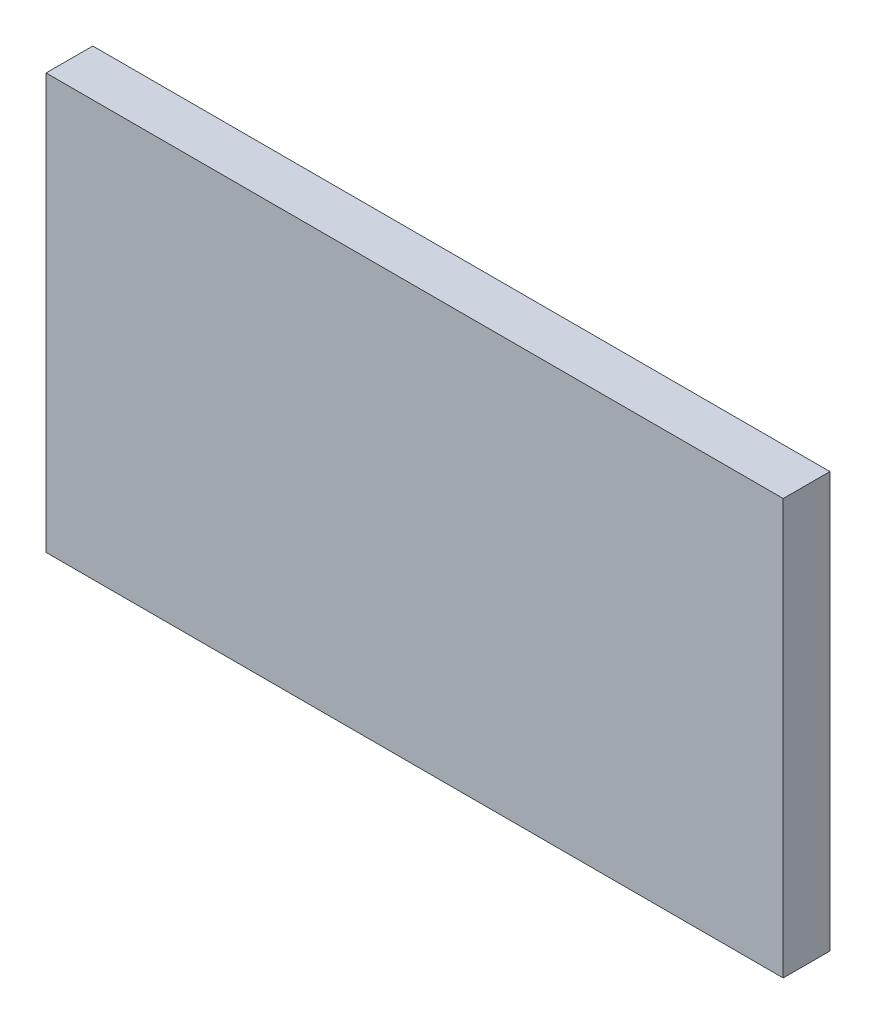
ISO-10303-21;
HEADER;
FILE_DESCRIPTION(('STEP AP214'),'2;1');
FILE_NAME('part.step','',(''),(''),'','','');
FILE_SCHEMA(('AUTOMOTIVE_DESIGN { 1 0 10303 214 1 1 1 1 }'));
ENDSEC;
DATA;
#1=APPLICATION_CONTEXT('core data for automotive mechanical design processes');
#2=APPLICATION_PROTOCOL_DEFINITION('international standard','automotive_design',2000,#1);
#3=PRODUCT_CONTEXT('',#1,'mechanical');
#4=PRODUCT('Part','Part','',(#3));
#5=PRODUCT_RELATED_PRODUCT_CATEGORY('part','',(#4));
#6=PRODUCT_DEFINITION_FORMATION('','',#4);
#7=PRODUCT_DEFINITION_CONTEXT('part definition',#1,'design');
#8=PRODUCT_DEFINITION('design','',#6,#7);
#9=PRODUCT_DEFINITION_SHAPE('','',#8);
#10=(LENGTH_UNIT() NAMED_UNIT(*) SI_UNIT(.MILLI.,.METRE.));
#11=(NAMED_UNIT(*) PLANE_ANGLE_UNIT() SI_UNIT($,.RADIAN.));
#12=(NAMED_UNIT(*) SI_UNIT($,.STERADIAN.) SOLID_ANGLE_UNIT());
#13=UNCERTAINTY_MEASURE_WITH_UNIT(LENGTH_MEASURE(1.E-05),#10,'distance_accuracy_value','');
#14=(GEOMETRIC_REPRESENTATION_CONTEXT(3) GLOBAL_UNCERTAINTY_ASSIGNED_CONTEXT((#13)) GLOBAL_UNIT_ASSIGNED_CONTEXT((#10,
#11,#12)) REPRESENTATION_CONTEXT('',''));
#15=CARTESIAN_POINT('',(0.,0.,0.));
#16=DIRECTION('',(0.,0.,1.));
#17=DIRECTION('',(1.,0.,0.));
#18=AXIS2_PLACEMENT_3D('',#15,#16,#17);
#19=CARTESIAN_POINT('',(0.,0.,4.826));
#20=DIRECTION('',(1.,0.,0.));
#21=DIRECTION('',(0.,0.,-1.));
#22=AXIS2_PLACEMENT_3D('',#19,#20,#21);
#23=PLANE('',#22);
#24=DIRECTION('',(0.,-1.,0.));
#25=VECTOR('',#24,1.);
#26=CARTESIAN_POINT('',(0.,0.,0.));
#27=LINE('',#26,#25);
#28=CARTESIAN_POINT('',(0.,42.926,0.));
#29=VERTEX_POINT('',#28);
#30=CARTESIAN_POINT('',(0.,0.,0.));
#31=VERTEX_POINT('',#30);
#32=EDGE_CURVE('E96',#29,#31,#27,.T.);
#33=ORIENTED_EDGE('',*,*,#32,.T.);
#34=DIRECTION('',(0.,0.,-1.));
#35=VECTOR('',#34,1.);
#36=CARTESIAN_POINT('',(0.,0.,4.826));
#37=LINE('',#36,#35);
#38=CARTESIAN_POINT('',(0.,0.,4.826));
#39=VERTEX_POINT('',#38);
#40=EDGE_CURVE('E11',#39,#31,#37,.T.);
#41=ORIENTED_EDGE('',*,*,#40,.F.);
#42=DIRECTION('',(0.,-1.,0.));
#43=VECTOR('',#42,1.);
#44=CARTESIAN_POINT('',(0.,0.,4.826));
#45=LINE('',#44,#43);
#46=CARTESIAN_POINT('',(0.,42.926,4.826));
#47=VERTEX_POINT('',#46);
#48=EDGE_CURVE('E84',#47,#39,#45,.T.);
#49=ORIENTED_EDGE('',*,*,#48,.F.);
#50=DIRECTION('',(0.,0.,-1.));
#51=VECTOR('',#50,1.);
#52=CARTESIAN_POINT('',(0.,42.926,4.826));
#53=LINE('',#52,#51);
#54=EDGE_CURVE('E92',#47,#29,#53,.T.);
#55=ORIENTED_EDGE('',*,*,#54,.T.);
#56=EDGE_LOOP('',(#33,#41,#49,#55));
#57=FACE_BOUND('',#56,.T.);
#58=ADVANCED_FACE('F33',(#57),#23,.F.);
#59=CARTESIAN_POINT('',(0.,0.,4.826));
#60=DIRECTION('',(0.,1.,0.));
#61=DIRECTION('',(0.,0.,1.));
#62=AXIS2_PLACEMENT_3D('',#59,#60,#61);
#63=PLANE('',#62);
#64=DIRECTION('',(1.,0.,0.));
#65=VECTOR('',#64,1.);
#66=CARTESIAN_POINT('',(0.,0.,0.));
#67=LINE('',#66,#65);
#68=CARTESIAN_POINT('',(76.2,0.,0.));
#69=VERTEX_POINT('',#68);
#70=EDGE_CURVE('E88',#31,#69,#67,.T.);
#71=ORIENTED_EDGE('',*,*,#70,.T.);
#72=DIRECTION('',(0.,0.,-1.));
#73=VECTOR('',#72,1.);
#74=CARTESIAN_POINT('',(76.2,0.,4.826));
#75=LINE('',#74,#73);
#76=CARTESIAN_POINT('',(76.2,0.,4.826));
#77=VERTEX_POINT('',#76);
#78=EDGE_CURVE('E41',#77,#69,#75,.T.);
#79=ORIENTED_EDGE('',*,*,#78,.F.);
#80=DIRECTION('',(1.,0.,0.));
#81=VECTOR('',#80,1.);
#82=CARTESIAN_POINT('',(0.,0.,4.826));
#83=LINE('',#82,#81);
#84=EDGE_CURVE('E79',#39,#77,#83,.T.);
#85=ORIENTED_EDGE('',*,*,#84,.F.);
#86=ORIENTED_EDGE('',*,*,#40,.T.);
#87=EDGE_LOOP('',(#71,#79,#85,#86));
#88=FACE_BOUND('',#87,.T.);
#89=ADVANCED_FACE('F87',(#88),#63,.F.);
#90=CARTESIAN_POINT('',(76.2,0.,4.826));
#91=DIRECTION('',(-1.,0.,0.));
#92=DIRECTION('',(0.,0.,1.));
#93=AXIS2_PLACEMENT_3D('',#90,#91,#92);
#94=PLANE('',#93);
#95=DIRECTION('',(0.,1.,0.));
#96=VECTOR('',#95,1.);
#97=CARTESIAN_POINT('',(76.2,0.,0.));
#98=LINE('',#97,#96);
#99=CARTESIAN_POINT('',(76.2,42.926,0.));
#100=VERTEX_POINT('',#99);
#101=EDGE_CURVE('E66',#69,#100,#98,.T.);
#102=ORIENTED_EDGE('',*,*,#101,.T.);
#103=DIRECTION('',(0.,0.,-1.));
#104=VECTOR('',#103,1.);
#105=CARTESIAN_POINT('',(76.2,42.926,4.826));
#106=LINE('',#105,#104);
#107=CARTESIAN_POINT('',(76.2,42.926,4.826));
#108=VERTEX_POINT('',#107);
#109=EDGE_CURVE('E89',#108,#100,#106,.T.);
#110=ORIENTED_EDGE('',*,*,#109,.F.);
#111=DIRECTION('',(0.,1.,0.));
#112=VECTOR('',#111,1.);
#113=CARTESIAN_POINT('',(76.2,0.,4.826));
#114=LINE('',#113,#112);
#115=EDGE_CURVE('E82',#77,#108,#114,.T.);
#116=ORIENTED_EDGE('',*,*,#115,.F.);
#117=ORIENTED_EDGE('',*,*,#78,.T.);
#118=EDGE_LOOP('',(#102,#110,#116,#117));
#119=FACE_BOUND('',#118,.T.);
#120=ADVANCED_FACE('F90',(#119),#94,.F.);
#121=CARTESIAN_POINT('',(0.,42.926,4.826));
#122=DIRECTION('',(0.,-1.,0.));
#123=DIRECTION('',(0.,0.,-1.));
#124=AXIS2_PLACEMENT_3D('',#121,#122,#123);
#125=PLANE('',#124);
#126=DIRECTION('',(-1.,0.,0.));
#127=VECTOR('',#126,1.);
#128=CARTESIAN_POINT('',(0.,42.926,0.));
#129=LINE('',#128,#127);
#130=EDGE_CURVE('E72',#100,#29,#129,.T.);
#131=ORIENTED_EDGE('',*,*,#130,.T.);
#132=ORIENTED_EDGE('',*,*,#54,.F.);
#133=DIRECTION('',(-1.,0.,0.));
#134=VECTOR('',#133,1.);
#135=CARTESIAN_POINT('',(0.,42.926,4.826));
#136=LINE('',#135,#134);
#137=EDGE_CURVE('E49',#108,#47,#136,.T.);
#138=ORIENTED_EDGE('',*,*,#137,.F.);
#139=ORIENTED_EDGE('',*,*,#109,.T.);
#140=EDGE_LOOP('',(#131,#132,#138,#139));
#141=FACE_BOUND('',#140,.T.);
#142=ADVANCED_FACE('F103',(#141),#125,.F.);
#143=CARTESIAN_POINT('',(0.,0.,4.826));
#144=DIRECTION('',(0.,0.,-1.));
#145=DIRECTION('',(-1.,0.,0.));
#146=AXIS2_PLACEMENT_3D('',#143,#144,#145);
#147=PLANE('',#146);
#148=ORIENTED_EDGE('',*,*,#48,.T.);
#149=ORIENTED_EDGE('',*,*,#84,.T.);
#150=ORIENTED_EDGE('',*,*,#115,.T.);
#151=ORIENTED_EDGE('',*,*,#137,.T.);
#152=EDGE_LOOP('',(#148,#149,#150,#151));
#153=FACE_BOUND('',#152,.T.);
#154=ADVANCED_FACE('F80',(#153),#147,.F.);
#155=CARTESIAN_POINT('',(0.,0.,0.));
#156=DIRECTION('',(0.,0.,-1.));
#157=DIRECTION('',(-1.,0.,0.));
#158=AXIS2_PLACEMENT_3D('',#155,#156,#157);
#159=PLANE('',#158);
#160=ORIENTED_EDGE('',*,*,#32,.F.);
#161=ORIENTED_EDGE('',*,*,#130,.F.);
#162=ORIENTED_EDGE('',*,*,#101,.F.);
#163=ORIENTED_EDGE('',*,*,#70,.F.);
#164=EDGE_LOOP('',(#160,#161,#162,#163));
#165=FACE_BOUND('',#164,.T.);
#166=ADVANCED_FACE('F106',(#165),#159,.T.);
#167=CLOSED_SHELL('',(#58,#89,#120,#142,#154,#166));
#168=MANIFOLD_SOLID_BREP('B2',#167);
#169=ADVANCED_BREP_SHAPE_REPRESENTATION('',(#18,#168),#14);
#170=SHAPE_DEFINITION_REPRESENTATION(#9,#169);
ENDSEC;
END-ISO-10303-21;
